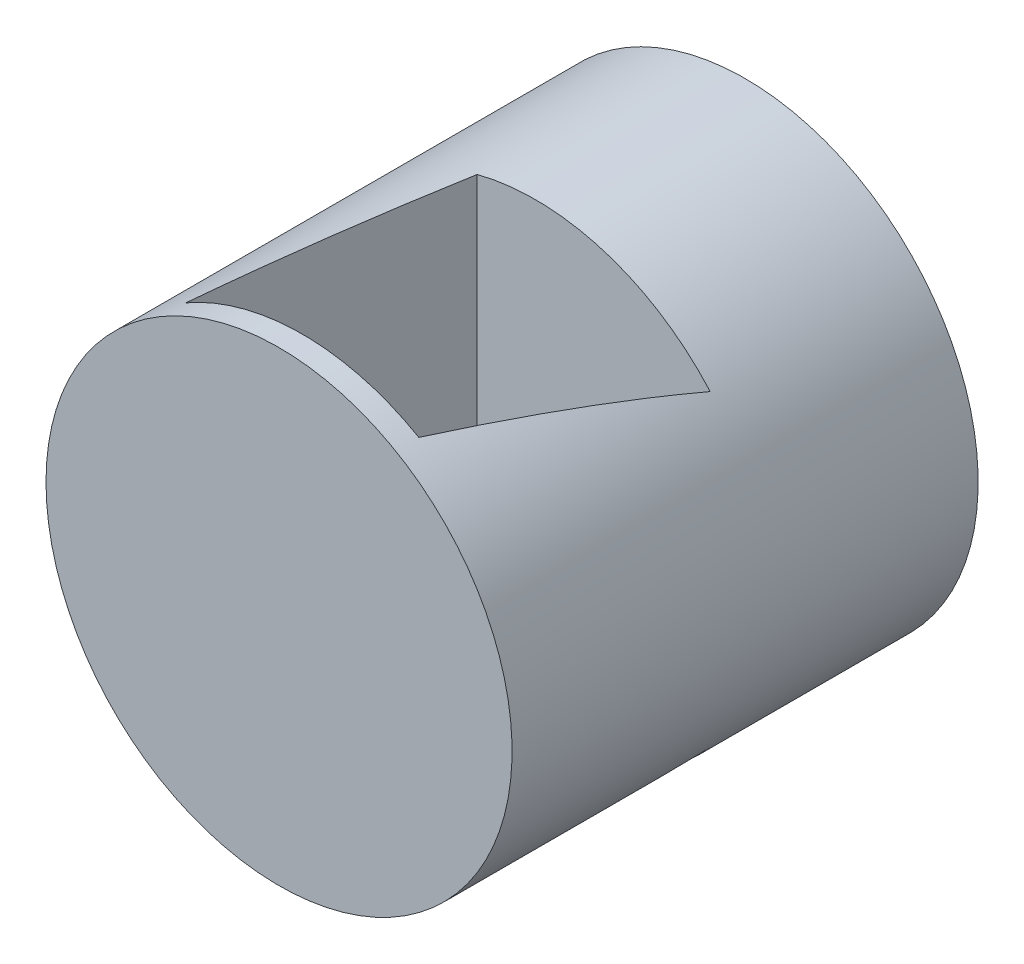
ISO-10303-21;
HEADER;
FILE_DESCRIPTION(('STEP AP214'),'2;1');
FILE_NAME('part.step','',(''),(''),'','','');
FILE_SCHEMA(('AUTOMOTIVE_DESIGN { 1 0 10303 214 1 1 1 1 }'));
ENDSEC;
DATA;
#1=APPLICATION_CONTEXT('core data for automotive mechanical design processes');
#2=APPLICATION_PROTOCOL_DEFINITION('international standard','automotive_design',2000,#1);
#3=PRODUCT_CONTEXT('',#1,'mechanical');
#4=PRODUCT('Part','Part','',(#3));
#5=PRODUCT_RELATED_PRODUCT_CATEGORY('part','',(#4));
#6=PRODUCT_DEFINITION_FORMATION('','',#4);
#7=PRODUCT_DEFINITION_CONTEXT('part definition',#1,'design');
#8=PRODUCT_DEFINITION('design','',#6,#7);
#9=PRODUCT_DEFINITION_SHAPE('','',#8);
#10=(LENGTH_UNIT() NAMED_UNIT(*) SI_UNIT(.MILLI.,.METRE.));
#11=(NAMED_UNIT(*) PLANE_ANGLE_UNIT() SI_UNIT($,.RADIAN.));
#12=(NAMED_UNIT(*) SI_UNIT($,.STERADIAN.) SOLID_ANGLE_UNIT());
#13=UNCERTAINTY_MEASURE_WITH_UNIT(LENGTH_MEASURE(1.E-05),#10,'distance_accuracy_value','');
#14=(GEOMETRIC_REPRESENTATION_CONTEXT(3) GLOBAL_UNCERTAINTY_ASSIGNED_CONTEXT((#13)) GLOBAL_UNIT_ASSIGNED_CONTEXT((#10,
#11,#12)) REPRESENTATION_CONTEXT('',''));
#15=CARTESIAN_POINT('',(0.,0.,0.));
#16=DIRECTION('',(0.,0.,1.));
#17=DIRECTION('',(1.,0.,0.));
#18=AXIS2_PLACEMENT_3D('',#15,#16,#17);
#19=CARTESIAN_POINT('',(0.,0.,-10.));
#20=DIRECTION('',(0.,0.,-1.));
#21=DIRECTION('',(-1.,0.,0.));
#22=AXIS2_PLACEMENT_3D('',#19,#20,#21);
#23=CYLINDRICAL_SURFACE('',#22,10.);
#24=CARTESIAN_POINT('',(0.,0.,-11.));
#25=DIRECTION('',(0.970142500145332,0.,0.242535625036333));
#26=DIRECTION('',(0.242535625036333,0.,-0.970142500145332));
#27=AXIS2_PLACEMENT_3D('',#24,#25,#26);
#28=ELLIPSE('',#27,41.2310562561766,10.);
#29=CARTESIAN_POINT('',(-5.,-8.66025403784438,9.));
#30=VERTEX_POINT('',#29);
#31=CARTESIAN_POINT('',(-2.5,-9.68245836551854,-0.999999999999997));
#32=VERTEX_POINT('',#31);
#33=EDGE_CURVE('E43',#30,#32,#28,.T.);
#34=ORIENTED_EDGE('',*,*,#33,.F.);
#35=CARTESIAN_POINT('',(0.,0.,9.));
#36=DIRECTION('',(0.,0.,1.));
#37=DIRECTION('',(1.,0.,0.));
#38=AXIS2_PLACEMENT_3D('',#35,#36,#37);
#39=CIRCLE('',#38,10.);
#40=CARTESIAN_POINT('',(5.,-8.66025403784438,9.));
#41=VERTEX_POINT('',#40);
#42=EDGE_CURVE('E92',#30,#41,#39,.T.);
#43=ORIENTED_EDGE('',*,*,#42,.T.);
#44=CARTESIAN_POINT('',(0.,0.,29.));
#45=DIRECTION('',(-0.970142500145332,0.,-0.242535625036333));
#46=DIRECTION('',(0.242535625036333,0.,-0.970142500145332));
#47=AXIS2_PLACEMENT_3D('',#44,#45,#46);
#48=ELLIPSE('',#47,41.2310562561766,10.);
#49=CARTESIAN_POINT('',(7.5,-6.61437827766148,-0.999999999999997));
#50=VERTEX_POINT('',#49);
#51=EDGE_CURVE('E94',#50,#41,#48,.T.);
#52=ORIENTED_EDGE('',*,*,#51,.F.);
#53=CARTESIAN_POINT('',(0.,0.,-0.999999999999997));
#54=DIRECTION('',(0.,0.,-1.));
#55=DIRECTION('',(-1.,0.,0.));
#56=AXIS2_PLACEMENT_3D('',#53,#54,#55);
#57=CIRCLE('',#56,10.);
#58=EDGE_CURVE('E79',#50,#32,#57,.T.);
#59=ORIENTED_EDGE('',*,*,#58,.T.);
#60=EDGE_LOOP('',(#34,#43,#52,#59));
#61=FACE_BOUND('',#60,.T.);
#62=CARTESIAN_POINT('',(0.,0.,-10.));
#63=DIRECTION('',(0.,0.,-1.));
#64=DIRECTION('',(-1.,0.,0.));
#65=AXIS2_PLACEMENT_3D('',#62,#63,#64);
#66=CIRCLE('',#65,10.);
#67=CARTESIAN_POINT('',(-10.,0.,-10.));
#68=VERTEX_POINT('',#67);
#69=EDGE_CURVE('E103',#68,#68,#66,.T.);
#70=ORIENTED_EDGE('',*,*,#69,.F.);
#71=EDGE_LOOP('',(#70));
#72=FACE_BOUND('',#71,.T.);
#73=CARTESIAN_POINT('',(0.,0.,10.));
#74=DIRECTION('',(0.,0.,-1.));
#75=DIRECTION('',(-1.,0.,0.));
#76=AXIS2_PLACEMENT_3D('',#73,#74,#75);
#77=CIRCLE('',#76,10.);
#78=CARTESIAN_POINT('',(-9.99999999999999,0.,10.));
#79=VERTEX_POINT('',#78);
#80=EDGE_CURVE('E99',#79,#79,#77,.T.);
#81=ORIENTED_EDGE('',*,*,#80,.T.);
#82=EDGE_LOOP('',(#81));
#83=FACE_BOUND('',#82,.T.);
#84=CARTESIAN_POINT('',(-2.5,9.68245836551854,-0.999999999999997));
#85=VERTEX_POINT('',#84);
#86=CARTESIAN_POINT('',(-5.,8.66025403784438,9.));
#87=VERTEX_POINT('',#86);
#88=EDGE_CURVE('E11',#85,#87,#28,.T.);
#89=ORIENTED_EDGE('',*,*,#88,.F.);
#90=CARTESIAN_POINT('',(7.5,6.61437827766148,-0.999999999999997));
#91=VERTEX_POINT('',#90);
#92=EDGE_CURVE('E72',#85,#91,#57,.T.);
#93=ORIENTED_EDGE('',*,*,#92,.T.);
#94=CARTESIAN_POINT('',(5.,8.66025403784439,9.));
#95=VERTEX_POINT('',#94);
#96=EDGE_CURVE('E77',#95,#91,#48,.T.);
#97=ORIENTED_EDGE('',*,*,#96,.F.);
#98=EDGE_CURVE('E42',#95,#87,#39,.T.);
#99=ORIENTED_EDGE('',*,*,#98,.T.);
#100=EDGE_LOOP('',(#89,#93,#97,#99));
#101=FACE_BOUND('',#100,.T.);
#102=ADVANCED_FACE('F33',(#61,#72,#83,#101),#23,.T.);
#103=CARTESIAN_POINT('',(10.,0.,-10.));
#104=DIRECTION('',(0.,0.,1.));
#105=DIRECTION('',(1.,0.,0.));
#106=AXIS2_PLACEMENT_3D('',#103,#104,#105);
#107=PLANE('',#106);
#108=CARTESIAN_POINT('',(0.,0.,-10.));
#109=DIRECTION('',(0.,0.,-1.));
#110=DIRECTION('',(-1.,0.,0.));
#111=AXIS2_PLACEMENT_3D('',#108,#109,#110);
#112=CIRCLE('',#111,0.999999999999999);
#113=CARTESIAN_POINT('',(-0.999999999999999,0.,-10.));
#114=VERTEX_POINT('',#113);
#115=EDGE_CURVE('E111',#114,#114,#112,.T.);
#116=ORIENTED_EDGE('',*,*,#115,.F.);
#117=EDGE_LOOP('',(#116));
#118=FACE_BOUND('',#117,.T.);
#119=ORIENTED_EDGE('',*,*,#69,.T.);
#120=EDGE_LOOP('',(#119));
#121=FACE_BOUND('',#120,.T.);
#122=ADVANCED_FACE('F35',(#118,#121),#107,.F.);
#123=CARTESIAN_POINT('',(0.,0.,10.));
#124=DIRECTION('',(0.,0.,-1.));
#125=DIRECTION('',(-1.,0.,0.));
#126=AXIS2_PLACEMENT_3D('',#123,#124,#125);
#127=PLANE('',#126);
#128=ORIENTED_EDGE('',*,*,#80,.F.);
#129=EDGE_LOOP('',(#128));
#130=FACE_BOUND('',#129,.T.);
#131=ADVANCED_FACE('F132',(#130),#127,.F.);
#132=CARTESIAN_POINT('',(-2.5,13.,-0.999999999999997));
#133=DIRECTION('',(0.970142500145332,0.,0.242535625036333));
#134=DIRECTION('',(0.242535625036333,0.,-0.970142500145332));
#135=AXIS2_PLACEMENT_3D('',#132,#133,#134);
#136=PLANE('',#135);
#137=ORIENTED_EDGE('',*,*,#88,.T.);
#138=DIRECTION('',(0.,-1.,0.));
#139=VECTOR('',#138,1.);
#140=CARTESIAN_POINT('',(-5.,13.,9.));
#141=LINE('',#140,#139);
#142=EDGE_CURVE('E106',#87,#30,#141,.T.);
#143=ORIENTED_EDGE('',*,*,#142,.T.);
#144=ORIENTED_EDGE('',*,*,#33,.T.);
#145=DIRECTION('',(0.,-1.,0.));
#146=VECTOR('',#145,1.);
#147=CARTESIAN_POINT('',(-2.5,13.,-0.999999999999997));
#148=LINE('',#147,#146);
#149=EDGE_CURVE('E55',#85,#32,#148,.T.);
#150=ORIENTED_EDGE('',*,*,#149,.F.);
#151=EDGE_LOOP('',(#137,#143,#144,#150));
#152=FACE_BOUND('',#151,.T.);
#153=ADVANCED_FACE('F81',(#152),#136,.T.);
#154=CARTESIAN_POINT('',(5.,13.,9.));
#155=DIRECTION('',(0.,0.,1.));
#156=DIRECTION('',(1.,0.,0.));
#157=AXIS2_PLACEMENT_3D('',#154,#155,#156);
#158=PLANE('',#157);
#159=DIRECTION('',(0.,-1.,0.));
#160=VECTOR('',#159,1.);
#161=CARTESIAN_POINT('',(5.,13.,9.));
#162=LINE('',#161,#160);
#163=EDGE_CURVE('E108',#95,#41,#162,.T.);
#164=ORIENTED_EDGE('',*,*,#163,.T.);
#165=ORIENTED_EDGE('',*,*,#42,.F.);
#166=ORIENTED_EDGE('',*,*,#142,.F.);
#167=ORIENTED_EDGE('',*,*,#98,.F.);
#168=EDGE_LOOP('',(#164,#165,#166,#167));
#169=FACE_BOUND('',#168,.T.);
#170=ADVANCED_FACE('F142',(#169),#158,.F.);
#171=CARTESIAN_POINT('',(5.,13.,9.));
#172=DIRECTION('',(-0.970142500145332,0.,-0.242535625036333));
#173=DIRECTION('',(-0.242535625036333,0.,0.970142500145332));
#174=AXIS2_PLACEMENT_3D('',#171,#172,#173);
#175=PLANE('',#174);
#176=ORIENTED_EDGE('',*,*,#51,.T.);
#177=ORIENTED_EDGE('',*,*,#163,.F.);
#178=ORIENTED_EDGE('',*,*,#96,.T.);
#179=DIRECTION('',(0.,-1.,0.));
#180=VECTOR('',#179,1.);
#181=CARTESIAN_POINT('',(7.5,13.,-0.999999999999997));
#182=LINE('',#181,#180);
#183=EDGE_CURVE('E50',#91,#50,#182,.T.);
#184=ORIENTED_EDGE('',*,*,#183,.T.);
#185=EDGE_LOOP('',(#176,#177,#178,#184));
#186=FACE_BOUND('',#185,.T.);
#187=ADVANCED_FACE('F125',(#186),#175,.T.);
#188=CARTESIAN_POINT('',(-2.5,13.,-0.999999999999997));
#189=DIRECTION('',(0.,0.,-1.));
#190=DIRECTION('',(-1.,0.,0.));
#191=AXIS2_PLACEMENT_3D('',#188,#189,#190);
#192=PLANE('',#191);
#193=CARTESIAN_POINT('',(0.,0.,-0.999999999999997));
#194=DIRECTION('',(0.,0.,-1.));
#195=DIRECTION('',(-1.,0.,0.));
#196=AXIS2_PLACEMENT_3D('',#193,#194,#195);
#197=CIRCLE('',#196,0.999999999999998);
#198=CARTESIAN_POINT('',(-0.999999999999998,0.,-0.999999999999997));
#199=VERTEX_POINT('',#198);
#200=EDGE_CURVE('E37',#199,#199,#197,.T.);
#201=ORIENTED_EDGE('',*,*,#200,.T.);
#202=EDGE_LOOP('',(#201));
#203=FACE_BOUND('',#202,.T.);
#204=ORIENTED_EDGE('',*,*,#149,.T.);
#205=ORIENTED_EDGE('',*,*,#58,.F.);
#206=ORIENTED_EDGE('',*,*,#183,.F.);
#207=ORIENTED_EDGE('',*,*,#92,.F.);
#208=EDGE_LOOP('',(#204,#205,#206,#207));
#209=FACE_BOUND('',#208,.T.);
#210=ADVANCED_FACE('F73',(#203,#209),#192,.F.);
#211=CARTESIAN_POINT('',(0.,0.,-10.));
#212=DIRECTION('',(0.,0.,-1.));
#213=DIRECTION('',(-1.,0.,0.));
#214=AXIS2_PLACEMENT_3D('',#211,#212,#213);
#215=CYLINDRICAL_SURFACE('',#214,0.999999999999998);
#216=ORIENTED_EDGE('',*,*,#115,.T.);
#217=EDGE_LOOP('',(#216));
#218=FACE_BOUND('',#217,.T.);
#219=ORIENTED_EDGE('',*,*,#200,.F.);
#220=EDGE_LOOP('',(#219));
#221=FACE_BOUND('',#220,.T.);
#222=ADVANCED_FACE('F119',(#218,#221),#215,.F.);
#223=CLOSED_SHELL('',(#102,#122,#131,#153,#170,#187,#210,#222));
#224=MANIFOLD_SOLID_BREP('B2',#223);
#225=ADVANCED_BREP_SHAPE_REPRESENTATION('',(#18,#224),#14);
#226=SHAPE_DEFINITION_REPRESENTATION(#9,#225);
ENDSEC;
END-ISO-10303-21;
